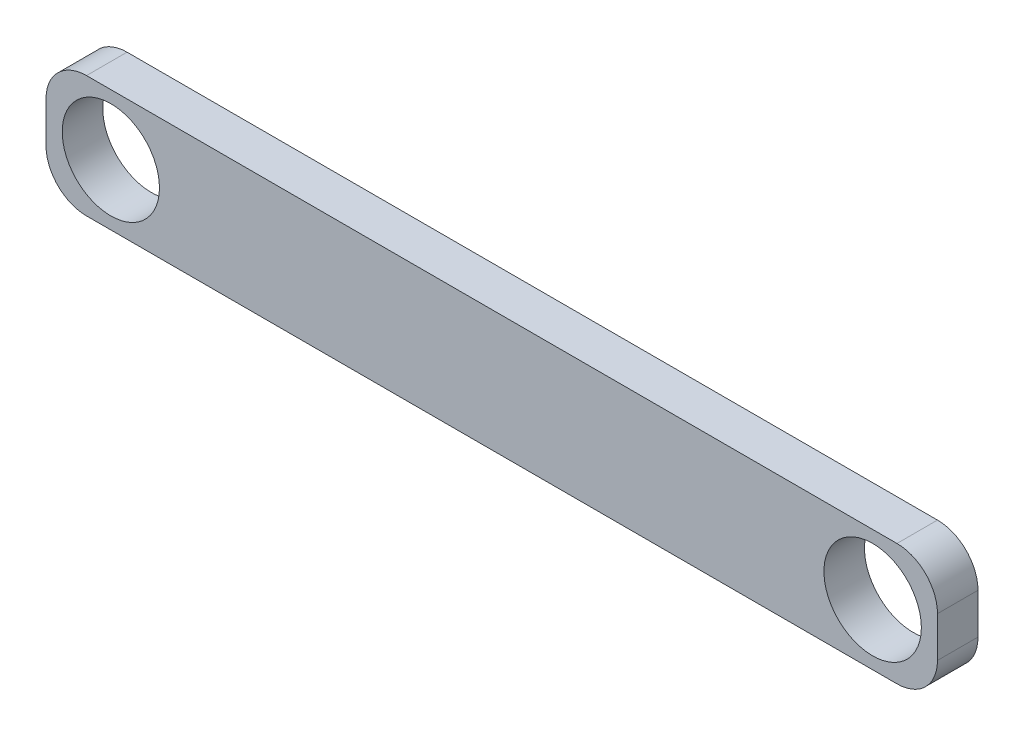
ISO-10303-21;
HEADER;
FILE_DESCRIPTION(('STEP AP214'),'2;1');
FILE_NAME('part.step','',(''),(''),'','','');
FILE_SCHEMA(('AUTOMOTIVE_DESIGN { 1 0 10303 214 1 1 1 1 }'));
ENDSEC;
DATA;
#1=APPLICATION_CONTEXT('core data for automotive mechanical design processes');
#2=APPLICATION_PROTOCOL_DEFINITION('international standard','automotive_design',2000,#1);
#3=PRODUCT_CONTEXT('',#1,'mechanical');
#4=PRODUCT('Part','Part','',(#3));
#5=PRODUCT_RELATED_PRODUCT_CATEGORY('part','',(#4));
#6=PRODUCT_DEFINITION_FORMATION('','',#4);
#7=PRODUCT_DEFINITION_CONTEXT('part definition',#1,'design');
#8=PRODUCT_DEFINITION('design','',#6,#7);
#9=PRODUCT_DEFINITION_SHAPE('','',#8);
#10=(LENGTH_UNIT() NAMED_UNIT(*) SI_UNIT(.MILLI.,.METRE.));
#11=(NAMED_UNIT(*) PLANE_ANGLE_UNIT() SI_UNIT($,.RADIAN.));
#12=(NAMED_UNIT(*) SI_UNIT($,.STERADIAN.) SOLID_ANGLE_UNIT());
#13=UNCERTAINTY_MEASURE_WITH_UNIT(LENGTH_MEASURE(1.E-05),#10,'distance_accuracy_value','');
#14=(GEOMETRIC_REPRESENTATION_CONTEXT(3) GLOBAL_UNCERTAINTY_ASSIGNED_CONTEXT((#13)) GLOBAL_UNIT_ASSIGNED_CONTEXT((#10,
#11,#12)) REPRESENTATION_CONTEXT('',''));
#15=CARTESIAN_POINT('',(0.,0.,0.));
#16=DIRECTION('',(0.,0.,1.));
#17=DIRECTION('',(1.,0.,0.));
#18=AXIS2_PLACEMENT_3D('',#15,#16,#17);
#19=CARTESIAN_POINT('',(105.,10.,5.));
#20=DIRECTION('',(0.,0.,-1.));
#21=DIRECTION('',(-1.,0.,0.));
#22=AXIS2_PLACEMENT_3D('',#19,#20,#21);
#23=CYLINDRICAL_SURFACE('',#22,5.);
#24=CARTESIAN_POINT('',(105.,10.,0.));
#25=DIRECTION('',(0.,0.,1.));
#26=DIRECTION('',(1.,0.,0.));
#27=AXIS2_PLACEMENT_3D('',#24,#25,#26);
#28=CIRCLE('',#27,5.);
#29=CARTESIAN_POINT('',(105.,15.,0.));
#30=VERTEX_POINT('',#29);
#31=CARTESIAN_POINT('',(110.,10.,0.));
#32=VERTEX_POINT('',#31);
#33=EDGE_CURVE('E167',#30,#32,#28,.F.);
#34=ORIENTED_EDGE('',*,*,#33,.F.);
#35=DIRECTION('',(0.,0.,-1.));
#36=VECTOR('',#35,1.);
#37=CARTESIAN_POINT('',(105.,15.,5.));
#38=LINE('',#37,#36);
#39=CARTESIAN_POINT('',(105.,15.,5.));
#40=VERTEX_POINT('',#39);
#41=EDGE_CURVE('E11',#40,#30,#38,.T.);
#42=ORIENTED_EDGE('',*,*,#41,.F.);
#43=CARTESIAN_POINT('',(105.,10.,5.));
#44=DIRECTION('',(0.,0.,1.));
#45=DIRECTION('',(1.,0.,0.));
#46=AXIS2_PLACEMENT_3D('',#43,#44,#45);
#47=CIRCLE('',#46,5.);
#48=CARTESIAN_POINT('',(110.,10.,5.));
#49=VERTEX_POINT('',#48);
#50=EDGE_CURVE('E358',#40,#49,#47,.F.);
#51=ORIENTED_EDGE('',*,*,#50,.T.);
#52=DIRECTION('',(0.,0.,-1.));
#53=VECTOR('',#52,1.);
#54=CARTESIAN_POINT('',(110.,10.,5.));
#55=LINE('',#54,#53);
#56=EDGE_CURVE('E93',#49,#32,#55,.T.);
#57=ORIENTED_EDGE('',*,*,#56,.T.);
#58=EDGE_LOOP('',(#34,#42,#51,#57));
#59=FACE_BOUND('',#58,.T.);
#60=ADVANCED_FACE('F41',(#59),#23,.T.);
#61=CARTESIAN_POINT('',(0.,15.,5.));
#62=DIRECTION('',(0.,1.,0.));
#63=DIRECTION('',(-1.,0.,0.));
#64=AXIS2_PLACEMENT_3D('',#61,#62,#63);
#65=PLANE('',#64);
#66=DIRECTION('',(1.,0.,0.));
#67=VECTOR('',#66,1.);
#68=CARTESIAN_POINT('',(0.,15.,0.));
#69=LINE('',#68,#67);
#70=CARTESIAN_POINT('',(5.,15.,0.));
#71=VERTEX_POINT('',#70);
#72=EDGE_CURVE('E164',#71,#30,#69,.T.);
#73=ORIENTED_EDGE('',*,*,#72,.F.);
#74=DIRECTION('',(0.,0.,-1.));
#75=VECTOR('',#74,1.);
#76=CARTESIAN_POINT('',(5.,15.,5.));
#77=LINE('',#76,#75);
#78=CARTESIAN_POINT('',(5.,15.,5.));
#79=VERTEX_POINT('',#78);
#80=EDGE_CURVE('E51',#79,#71,#77,.T.);
#81=ORIENTED_EDGE('',*,*,#80,.F.);
#82=DIRECTION('',(1.,0.,0.));
#83=VECTOR('',#82,1.);
#84=CARTESIAN_POINT('',(0.,15.,5.));
#85=LINE('',#84,#83);
#86=EDGE_CURVE('E355',#79,#40,#85,.T.);
#87=ORIENTED_EDGE('',*,*,#86,.T.);
#88=ORIENTED_EDGE('',*,*,#41,.T.);
#89=EDGE_LOOP('',(#73,#81,#87,#88));
#90=FACE_BOUND('',#89,.T.);
#91=ADVANCED_FACE('F165',(#90),#65,.T.);
#92=CARTESIAN_POINT('',(5.,10.,5.));
#93=DIRECTION('',(0.,0.,-1.));
#94=DIRECTION('',(-1.,0.,0.));
#95=AXIS2_PLACEMENT_3D('',#92,#93,#94);
#96=CYLINDRICAL_SURFACE('',#95,5.);
#97=CARTESIAN_POINT('',(5.,10.,0.));
#98=DIRECTION('',(0.,0.,1.));
#99=DIRECTION('',(1.,0.,0.));
#100=AXIS2_PLACEMENT_3D('',#97,#98,#99);
#101=CIRCLE('',#100,5.);
#102=CARTESIAN_POINT('',(0.,10.,0.));
#103=VERTEX_POINT('',#102);
#104=EDGE_CURVE('E156',#103,#71,#101,.F.);
#105=ORIENTED_EDGE('',*,*,#104,.F.);
#106=DIRECTION('',(0.,0.,-1.));
#107=VECTOR('',#106,1.);
#108=CARTESIAN_POINT('',(0.,10.,5.));
#109=LINE('',#108,#107);
#110=CARTESIAN_POINT('',(0.,10.,5.));
#111=VERTEX_POINT('',#110);
#112=EDGE_CURVE('E147',#111,#103,#109,.T.);
#113=ORIENTED_EDGE('',*,*,#112,.F.);
#114=CARTESIAN_POINT('',(5.,10.,5.));
#115=DIRECTION('',(0.,0.,1.));
#116=DIRECTION('',(1.,0.,0.));
#117=AXIS2_PLACEMENT_3D('',#114,#115,#116);
#118=CIRCLE('',#117,5.);
#119=EDGE_CURVE('E159',#111,#79,#118,.F.);
#120=ORIENTED_EDGE('',*,*,#119,.T.);
#121=ORIENTED_EDGE('',*,*,#80,.T.);
#122=EDGE_LOOP('',(#105,#113,#120,#121));
#123=FACE_BOUND('',#122,.T.);
#124=ADVANCED_FACE('F154',(#123),#96,.T.);
#125=CARTESIAN_POINT('',(0.,0.,5.));
#126=DIRECTION('',(-1.,0.,0.));
#127=DIRECTION('',(0.,0.,1.));
#128=AXIS2_PLACEMENT_3D('',#125,#126,#127);
#129=PLANE('',#128);
#130=DIRECTION('',(0.,1.,0.));
#131=VECTOR('',#130,1.);
#132=CARTESIAN_POINT('',(0.,0.,0.));
#133=LINE('',#132,#131);
#134=CARTESIAN_POINT('',(0.,5.00000000000004,0.));
#135=VERTEX_POINT('',#134);
#136=EDGE_CURVE('E172',#135,#103,#133,.T.);
#137=ORIENTED_EDGE('',*,*,#136,.F.);
#138=DIRECTION('',(0.,0.,-1.));
#139=VECTOR('',#138,1.);
#140=CARTESIAN_POINT('',(0.,5.00000000000004,5.));
#141=LINE('',#140,#139);
#142=CARTESIAN_POINT('',(0.,5.00000000000004,5.));
#143=VERTEX_POINT('',#142);
#144=EDGE_CURVE('E140',#143,#135,#141,.T.);
#145=ORIENTED_EDGE('',*,*,#144,.F.);
#146=DIRECTION('',(0.,1.,0.));
#147=VECTOR('',#146,1.);
#148=CARTESIAN_POINT('',(0.,0.,5.));
#149=LINE('',#148,#147);
#150=EDGE_CURVE('E348',#143,#111,#149,.T.);
#151=ORIENTED_EDGE('',*,*,#150,.T.);
#152=ORIENTED_EDGE('',*,*,#112,.T.);
#153=EDGE_LOOP('',(#137,#145,#151,#152));
#154=FACE_BOUND('',#153,.T.);
#155=ADVANCED_FACE('F241',(#154),#129,.T.);
#156=CARTESIAN_POINT('',(5.,5.,5.));
#157=DIRECTION('',(0.,0.,-1.));
#158=DIRECTION('',(-1.,0.,0.));
#159=AXIS2_PLACEMENT_3D('',#156,#157,#158);
#160=CYLINDRICAL_SURFACE('',#159,5.);
#161=CARTESIAN_POINT('',(5.,5.,0.));
#162=DIRECTION('',(0.,0.,1.));
#163=DIRECTION('',(1.,0.,0.));
#164=AXIS2_PLACEMENT_3D('',#161,#162,#163);
#165=CIRCLE('',#164,5.);
#166=CARTESIAN_POINT('',(5.00000000000004,0.,0.));
#167=VERTEX_POINT('',#166);
#168=EDGE_CURVE('E176',#167,#135,#165,.F.);
#169=ORIENTED_EDGE('',*,*,#168,.F.);
#170=DIRECTION('',(0.,0.,-1.));
#171=VECTOR('',#170,1.);
#172=CARTESIAN_POINT('',(5.00000000000004,0.,5.));
#173=LINE('',#172,#171);
#174=CARTESIAN_POINT('',(5.00000000000004,0.,5.));
#175=VERTEX_POINT('',#174);
#176=EDGE_CURVE('E136',#175,#167,#173,.T.);
#177=ORIENTED_EDGE('',*,*,#176,.F.);
#178=CARTESIAN_POINT('',(5.,5.,5.));
#179=DIRECTION('',(0.,0.,1.));
#180=DIRECTION('',(1.,0.,0.));
#181=AXIS2_PLACEMENT_3D('',#178,#179,#180);
#182=CIRCLE('',#181,5.);
#183=EDGE_CURVE('E128',#175,#143,#182,.F.);
#184=ORIENTED_EDGE('',*,*,#183,.T.);
#185=ORIENTED_EDGE('',*,*,#144,.T.);
#186=EDGE_LOOP('',(#169,#177,#184,#185));
#187=FACE_BOUND('',#186,.T.);
#188=ADVANCED_FACE('F238',(#187),#160,.T.);
#189=CARTESIAN_POINT('',(0.,0.,5.));
#190=DIRECTION('',(0.,1.,0.));
#191=DIRECTION('',(0.,0.,1.));
#192=AXIS2_PLACEMENT_3D('',#189,#190,#191);
#193=PLANE('',#192);
#194=DIRECTION('',(1.,0.,0.));
#195=VECTOR('',#194,1.);
#196=CARTESIAN_POINT('',(0.,0.,0.));
#197=LINE('',#196,#195);
#198=CARTESIAN_POINT('',(105.,0.,0.));
#199=VERTEX_POINT('',#198);
#200=EDGE_CURVE('E134',#167,#199,#197,.T.);
#201=ORIENTED_EDGE('',*,*,#200,.T.);
#202=DIRECTION('',(0.,0.,-1.));
#203=VECTOR('',#202,1.);
#204=CARTESIAN_POINT('',(105.,0.,5.));
#205=LINE('',#204,#203);
#206=CARTESIAN_POINT('',(105.,0.,5.));
#207=VERTEX_POINT('',#206);
#208=EDGE_CURVE('E117',#207,#199,#205,.T.);
#209=ORIENTED_EDGE('',*,*,#208,.F.);
#210=DIRECTION('',(1.,0.,0.));
#211=VECTOR('',#210,1.);
#212=CARTESIAN_POINT('',(0.,0.,5.));
#213=LINE('',#212,#211);
#214=EDGE_CURVE('E121',#175,#207,#213,.T.);
#215=ORIENTED_EDGE('',*,*,#214,.F.);
#216=ORIENTED_EDGE('',*,*,#176,.T.);
#217=EDGE_LOOP('',(#201,#209,#215,#216));
#218=FACE_BOUND('',#217,.T.);
#219=ADVANCED_FACE('F132',(#218),#193,.F.);
#220=CARTESIAN_POINT('',(105.,5.,5.));
#221=DIRECTION('',(0.,0.,-1.));
#222=DIRECTION('',(-1.,0.,0.));
#223=AXIS2_PLACEMENT_3D('',#220,#221,#222);
#224=CYLINDRICAL_SURFACE('',#223,5.);
#225=CARTESIAN_POINT('',(105.,5.,0.));
#226=DIRECTION('',(0.,0.,1.));
#227=DIRECTION('',(1.,0.,0.));
#228=AXIS2_PLACEMENT_3D('',#225,#226,#227);
#229=CIRCLE('',#228,5.);
#230=CARTESIAN_POINT('',(110.,5.,0.));
#231=VERTEX_POINT('',#230);
#232=EDGE_CURVE('E184',#199,#231,#229,.T.);
#233=ORIENTED_EDGE('',*,*,#232,.T.);
#234=DIRECTION('',(0.,0.,-1.));
#235=VECTOR('',#234,1.);
#236=CARTESIAN_POINT('',(110.,5.,5.));
#237=LINE('',#236,#235);
#238=CARTESIAN_POINT('',(110.,5.,5.));
#239=VERTEX_POINT('',#238);
#240=EDGE_CURVE('E119',#239,#231,#237,.T.);
#241=ORIENTED_EDGE('',*,*,#240,.F.);
#242=CARTESIAN_POINT('',(105.,5.,5.));
#243=DIRECTION('',(0.,0.,1.));
#244=DIRECTION('',(1.,0.,0.));
#245=AXIS2_PLACEMENT_3D('',#242,#243,#244);
#246=CIRCLE('',#245,5.);
#247=EDGE_CURVE('E112',#207,#239,#246,.T.);
#248=ORIENTED_EDGE('',*,*,#247,.F.);
#249=ORIENTED_EDGE('',*,*,#208,.T.);
#250=EDGE_LOOP('',(#233,#241,#248,#249));
#251=FACE_BOUND('',#250,.T.);
#252=ADVANCED_FACE('F115',(#251),#224,.T.);
#253=CARTESIAN_POINT('',(8.,7.5,5.));
#254=DIRECTION('',(0.,0.,-1.));
#255=DIRECTION('',(-1.,0.,0.));
#256=AXIS2_PLACEMENT_3D('',#253,#254,#255);
#257=CYLINDRICAL_SURFACE('',#256,6.);
#258=CARTESIAN_POINT('',(8.,7.5,5.));
#259=DIRECTION('',(0.,0.,1.));
#260=DIRECTION('',(1.,0.,0.));
#261=AXIS2_PLACEMENT_3D('',#258,#259,#260);
#262=CIRCLE('',#261,6.);
#263=CARTESIAN_POINT('',(14.,7.5,5.));
#264=VERTEX_POINT('',#263);
#265=EDGE_CURVE('E221',#264,#264,#262,.T.);
#266=ORIENTED_EDGE('',*,*,#265,.T.);
#267=EDGE_LOOP('',(#266));
#268=FACE_BOUND('',#267,.T.);
#269=CARTESIAN_POINT('',(8.,7.5,0.));
#270=DIRECTION('',(0.,0.,1.));
#271=DIRECTION('',(1.,0.,0.));
#272=AXIS2_PLACEMENT_3D('',#269,#270,#271);
#273=CIRCLE('',#272,6.);
#274=CARTESIAN_POINT('',(14.,7.5,0.));
#275=VERTEX_POINT('',#274);
#276=EDGE_CURVE('E197',#275,#275,#273,.T.);
#277=ORIENTED_EDGE('',*,*,#276,.F.);
#278=EDGE_LOOP('',(#277));
#279=FACE_BOUND('',#278,.T.);
#280=ADVANCED_FACE('F208',(#268,#279),#257,.F.);
#281=CARTESIAN_POINT('',(102.,7.5,5.));
#282=DIRECTION('',(0.,0.,-1.));
#283=DIRECTION('',(-1.,0.,0.));
#284=AXIS2_PLACEMENT_3D('',#281,#282,#283);
#285=CYLINDRICAL_SURFACE('',#284,6.01067113614138);
#286=CARTESIAN_POINT('',(102.,7.5,5.));
#287=DIRECTION('',(0.,0.,1.));
#288=DIRECTION('',(1.,0.,0.));
#289=AXIS2_PLACEMENT_3D('',#286,#287,#288);
#290=CIRCLE('',#289,6.01067113614138);
#291=CARTESIAN_POINT('',(108.010671136141,7.5,5.));
#292=VERTEX_POINT('',#291);
#293=EDGE_CURVE('E188',#292,#292,#290,.T.);
#294=ORIENTED_EDGE('',*,*,#293,.T.);
#295=EDGE_LOOP('',(#294));
#296=FACE_BOUND('',#295,.T.);
#297=CARTESIAN_POINT('',(102.,7.5,0.));
#298=DIRECTION('',(0.,0.,1.));
#299=DIRECTION('',(1.,0.,0.));
#300=AXIS2_PLACEMENT_3D('',#297,#298,#299);
#301=CIRCLE('',#300,6.01067113614138);
#302=CARTESIAN_POINT('',(108.010671136141,7.5,0.));
#303=VERTEX_POINT('',#302);
#304=EDGE_CURVE('E193',#303,#303,#301,.T.);
#305=ORIENTED_EDGE('',*,*,#304,.F.);
#306=EDGE_LOOP('',(#305));
#307=FACE_BOUND('',#306,.T.);
#308=ADVANCED_FACE('F43',(#296,#307),#285,.F.);
#309=CARTESIAN_POINT('',(110.,0.,5.));
#310=DIRECTION('',(-1.,0.,0.));
#311=DIRECTION('',(0.,0.,1.));
#312=AXIS2_PLACEMENT_3D('',#309,#310,#311);
#313=PLANE('',#312);
#314=DIRECTION('',(0.,1.,0.));
#315=VECTOR('',#314,1.);
#316=CARTESIAN_POINT('',(110.,0.,0.));
#317=LINE('',#316,#315);
#318=EDGE_CURVE('E86',#231,#32,#317,.T.);
#319=ORIENTED_EDGE('',*,*,#318,.T.);
#320=ORIENTED_EDGE('',*,*,#56,.F.);
#321=DIRECTION('',(0.,1.,0.));
#322=VECTOR('',#321,1.);
#323=CARTESIAN_POINT('',(110.,0.,5.));
#324=LINE('',#323,#322);
#325=EDGE_CURVE('E59',#239,#49,#324,.T.);
#326=ORIENTED_EDGE('',*,*,#325,.F.);
#327=ORIENTED_EDGE('',*,*,#240,.T.);
#328=EDGE_LOOP('',(#319,#320,#326,#327));
#329=FACE_BOUND('',#328,.T.);
#330=ADVANCED_FACE('F215',(#329),#313,.F.);
#331=CARTESIAN_POINT('',(0.,0.,5.));
#332=DIRECTION('',(0.,0.,1.));
#333=DIRECTION('',(1.,0.,0.));
#334=AXIS2_PLACEMENT_3D('',#331,#332,#333);
#335=PLANE('',#334);
#336=ORIENTED_EDGE('',*,*,#293,.F.);
#337=EDGE_LOOP('',(#336));
#338=FACE_BOUND('',#337,.T.);
#339=ORIENTED_EDGE('',*,*,#265,.F.);
#340=EDGE_LOOP('',(#339));
#341=FACE_BOUND('',#340,.T.);
#342=ORIENTED_EDGE('',*,*,#50,.F.);
#343=ORIENTED_EDGE('',*,*,#86,.F.);
#344=ORIENTED_EDGE('',*,*,#119,.F.);
#345=ORIENTED_EDGE('',*,*,#150,.F.);
#346=ORIENTED_EDGE('',*,*,#183,.F.);
#347=ORIENTED_EDGE('',*,*,#214,.T.);
#348=ORIENTED_EDGE('',*,*,#247,.T.);
#349=ORIENTED_EDGE('',*,*,#325,.T.);
#350=EDGE_LOOP('',(#342,#343,#344,#345,#346,#347,#348,#349));
#351=FACE_BOUND('',#350,.T.);
#352=ADVANCED_FACE('F125',(#338,#341,#351),#335,.T.);
#353=CARTESIAN_POINT('',(0.,0.,0.));
#354=DIRECTION('',(0.,0.,1.));
#355=DIRECTION('',(1.,0.,0.));
#356=AXIS2_PLACEMENT_3D('',#353,#354,#355);
#357=PLANE('',#356);
#358=ORIENTED_EDGE('',*,*,#304,.T.);
#359=EDGE_LOOP('',(#358));
#360=FACE_BOUND('',#359,.T.);
#361=ORIENTED_EDGE('',*,*,#276,.T.);
#362=EDGE_LOOP('',(#361));
#363=FACE_BOUND('',#362,.T.);
#364=ORIENTED_EDGE('',*,*,#33,.T.);
#365=ORIENTED_EDGE('',*,*,#318,.F.);
#366=ORIENTED_EDGE('',*,*,#232,.F.);
#367=ORIENTED_EDGE('',*,*,#200,.F.);
#368=ORIENTED_EDGE('',*,*,#168,.T.);
#369=ORIENTED_EDGE('',*,*,#136,.T.);
#370=ORIENTED_EDGE('',*,*,#104,.T.);
#371=ORIENTED_EDGE('',*,*,#72,.T.);
#372=EDGE_LOOP('',(#364,#365,#366,#367,#368,#369,#370,#371));
#373=FACE_BOUND('',#372,.T.);
#374=ADVANCED_FACE('F169',(#360,#363,#373),#357,.F.);
#375=CLOSED_SHELL('',(#60,#91,#124,#155,#188,#219,#252,#280,#308,#330,#352,#374));
#376=MANIFOLD_SOLID_BREP('B2',#375);
#377=ADVANCED_BREP_SHAPE_REPRESENTATION('',(#18,#376),#14);
#378=SHAPE_DEFINITION_REPRESENTATION(#9,#377);
ENDSEC;
END-ISO-10303-21;
